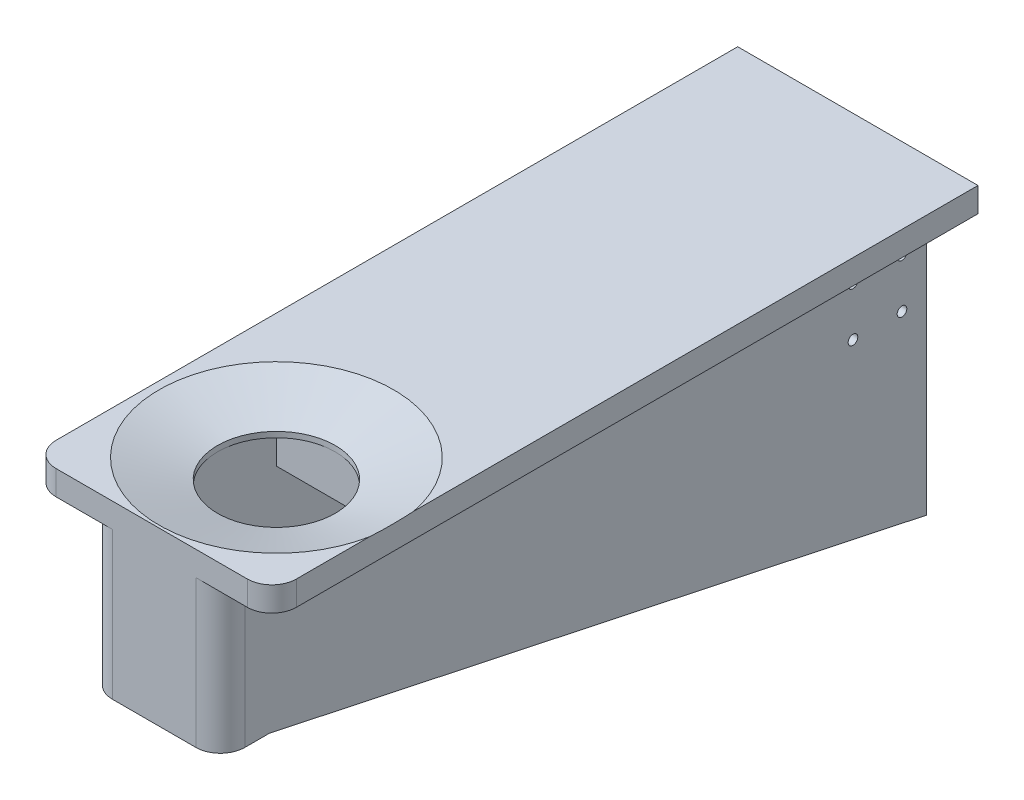
ISO-10303-21;
HEADER;
FILE_DESCRIPTION(('STEP AP214'),'2;1');
FILE_NAME('part.step','',(''),(''),'','','');
FILE_SCHEMA(('AUTOMOTIVE_DESIGN { 1 0 10303 214 1 1 1 1 }'));
ENDSEC;
DATA;
#1=APPLICATION_CONTEXT('core data for automotive mechanical design processes');
#2=APPLICATION_PROTOCOL_DEFINITION('international standard','automotive_design',2000,#1);
#3=PRODUCT_CONTEXT('',#1,'mechanical');
#4=PRODUCT('Part','Part','',(#3));
#5=PRODUCT_RELATED_PRODUCT_CATEGORY('part','',(#4));
#6=PRODUCT_DEFINITION_FORMATION('','',#4);
#7=PRODUCT_DEFINITION_CONTEXT('part definition',#1,'design');
#8=PRODUCT_DEFINITION('design','',#6,#7);
#9=PRODUCT_DEFINITION_SHAPE('','',#8);
#10=(LENGTH_UNIT() NAMED_UNIT(*) SI_UNIT(.MILLI.,.METRE.));
#11=(NAMED_UNIT(*) PLANE_ANGLE_UNIT() SI_UNIT($,.RADIAN.));
#12=(NAMED_UNIT(*) SI_UNIT($,.STERADIAN.) SOLID_ANGLE_UNIT());
#13=UNCERTAINTY_MEASURE_WITH_UNIT(LENGTH_MEASURE(1.E-05),#10,'distance_accuracy_value','');
#14=(GEOMETRIC_REPRESENTATION_CONTEXT(3) GLOBAL_UNCERTAINTY_ASSIGNED_CONTEXT((#13)) GLOBAL_UNIT_ASSIGNED_CONTEXT((#10,
#11,#12)) REPRESENTATION_CONTEXT('',''));
#15=CARTESIAN_POINT('',(0.,0.,0.));
#16=DIRECTION('',(0.,0.,1.));
#17=DIRECTION('',(1.,0.,0.));
#18=AXIS2_PLACEMENT_3D('',#15,#16,#17);
#19=CARTESIAN_POINT('',(17.145,-101.6,0.));
#20=DIRECTION('',(1.,0.,0.));
#21=DIRECTION('',(0.,0.,-1.));
#22=AXIS2_PLACEMENT_3D('',#19,#20,#21);
#23=PLANE('',#22);
#24=CARTESIAN_POINT('',(17.145,-12.7,-163.83));
#25=DIRECTION('',(1.,0.,0.));
#26=DIRECTION('',(0.,0.,-1.));
#27=AXIS2_PLACEMENT_3D('',#24,#25,#26);
#28=CIRCLE('',#27,1.24999999999999);
#29=CARTESIAN_POINT('',(17.145,-12.7,-165.08));
#30=VERTEX_POINT('',#29);
#31=EDGE_CURVE('E1086',#30,#30,#28,.T.);
#32=ORIENTED_EDGE('',*,*,#31,.F.);
#33=EDGE_LOOP('',(#32));
#34=FACE_BOUND('',#33,.T.);
#35=CARTESIAN_POINT('',(17.145,-25.4,-163.83));
#36=DIRECTION('',(1.,0.,0.));
#37=DIRECTION('',(0.,0.,-1.));
#38=AXIS2_PLACEMENT_3D('',#35,#36,#37);
#39=CIRCLE('',#38,1.24999999999999);
#40=CARTESIAN_POINT('',(17.145,-25.4,-165.08));
#41=VERTEX_POINT('',#40);
#42=EDGE_CURVE('E1074',#41,#41,#39,.T.);
#43=ORIENTED_EDGE('',*,*,#42,.F.);
#44=EDGE_LOOP('',(#43));
#45=FACE_BOUND('',#44,.T.);
#46=CARTESIAN_POINT('',(17.145,-25.4,-151.13));
#47=DIRECTION('',(1.,0.,0.));
#48=DIRECTION('',(0.,0.,-1.));
#49=AXIS2_PLACEMENT_3D('',#46,#47,#48);
#50=CIRCLE('',#49,1.24999999999999);
#51=CARTESIAN_POINT('',(17.145,-25.4,-152.38));
#52=VERTEX_POINT('',#51);
#53=EDGE_CURVE('E1095',#52,#52,#50,.T.);
#54=ORIENTED_EDGE('',*,*,#53,.F.);
#55=EDGE_LOOP('',(#54));
#56=FACE_BOUND('',#55,.T.);
#57=CARTESIAN_POINT('',(17.145,-12.7,-151.13));
#58=DIRECTION('',(1.,0.,0.));
#59=DIRECTION('',(0.,0.,-1.));
#60=AXIS2_PLACEMENT_3D('',#57,#58,#59);
#61=CIRCLE('',#60,1.24999999999999);
#62=CARTESIAN_POINT('',(17.145,-12.7,-152.38));
#63=VERTEX_POINT('',#62);
#64=EDGE_CURVE('E1068',#63,#63,#61,.T.);
#65=ORIENTED_EDGE('',*,*,#64,.F.);
#66=EDGE_LOOP('',(#65));
#67=FACE_BOUND('',#66,.T.);
#68=DIRECTION('',(0.,-1.,0.));
#69=VECTOR('',#68,1.);
#70=CARTESIAN_POINT('',(17.145,-101.6,-170.18));
#71=LINE('',#70,#69);
#72=CARTESIAN_POINT('',(17.145,0.,-170.18));
#73=VERTEX_POINT('',#72);
#74=CARTESIAN_POINT('',(17.145,-36.6200715561254,-170.18));
#75=VERTEX_POINT('',#74);
#76=EDGE_CURVE('E310',#73,#75,#71,.T.);
#77=ORIENTED_EDGE('',*,*,#76,.F.);
#78=DIRECTION('',(0.,0.,-1.));
#79=VECTOR('',#78,1.);
#80=CARTESIAN_POINT('',(17.145,0.,0.));
#81=LINE('',#80,#79);
#82=CARTESIAN_POINT('',(17.145,0.,-36.7310792907555));
#83=VERTEX_POINT('',#82);
#84=EDGE_CURVE('E451',#83,#73,#81,.T.);
#85=ORIENTED_EDGE('',*,*,#84,.F.);
#86=DIRECTION('',(0.,-1.,0.));
#87=VECTOR('',#86,1.);
#88=CARTESIAN_POINT('',(17.145,0.,-36.7310792907555));
#89=LINE('',#88,#87);
#90=CARTESIAN_POINT('',(17.145,-8.25462781159288,-36.7310792907555));
#91=VERTEX_POINT('',#90);
#92=EDGE_CURVE('E425',#83,#91,#89,.T.);
#93=ORIENTED_EDGE('',*,*,#92,.T.);
#94=DIRECTION('',(0.,-0.20791169081776,-0.978147600733805));
#95=VECTOR('',#94,1.);
#96=CARTESIAN_POINT('',(17.145,-0.427864833065413,0.0909454777759027));
#97=LINE('',#96,#95);
#98=EDGE_CURVE('E422',#91,#75,#97,.T.);
#99=ORIENTED_EDGE('',*,*,#98,.T.);
#100=EDGE_LOOP('',(#77,#85,#93,#99));
#101=FACE_BOUND('',#100,.T.);
#102=ADVANCED_FACE('F129',(#34,#45,#56,#67,#101),#23,.T.);
#103=CARTESIAN_POINT('',(46.355,-101.6,0.));
#104=DIRECTION('',(1.,0.,0.));
#105=DIRECTION('',(0.,0.,-1.));
#106=AXIS2_PLACEMENT_3D('',#103,#104,#105);
#107=PLANE('',#106);
#108=CARTESIAN_POINT('',(46.355,-12.7,-163.83));
#109=DIRECTION('',(1.,0.,0.));
#110=DIRECTION('',(0.,0.,-1.));
#111=AXIS2_PLACEMENT_3D('',#108,#109,#110);
#112=CIRCLE('',#111,1.24999999999999);
#113=CARTESIAN_POINT('',(46.355,-12.7,-165.08));
#114=VERTEX_POINT('',#113);
#115=EDGE_CURVE('E1082',#114,#114,#112,.T.);
#116=ORIENTED_EDGE('',*,*,#115,.T.);
#117=EDGE_LOOP('',(#116));
#118=FACE_BOUND('',#117,.T.);
#119=CARTESIAN_POINT('',(46.355,-25.4,-163.83));
#120=DIRECTION('',(1.,0.,0.));
#121=DIRECTION('',(0.,0.,-1.));
#122=AXIS2_PLACEMENT_3D('',#119,#120,#121);
#123=CIRCLE('',#122,1.24999999999999);
#124=CARTESIAN_POINT('',(46.355,-25.4,-165.08));
#125=VERTEX_POINT('',#124);
#126=EDGE_CURVE('E1079',#125,#125,#123,.T.);
#127=ORIENTED_EDGE('',*,*,#126,.T.);
#128=EDGE_LOOP('',(#127));
#129=FACE_BOUND('',#128,.T.);
#130=CARTESIAN_POINT('',(46.355,-25.4,-151.13));
#131=DIRECTION('',(1.,0.,0.));
#132=DIRECTION('',(0.,0.,-1.));
#133=AXIS2_PLACEMENT_3D('',#130,#131,#132);
#134=CIRCLE('',#133,1.24999999999999);
#135=CARTESIAN_POINT('',(46.355,-25.4,-152.38));
#136=VERTEX_POINT('',#135);
#137=EDGE_CURVE('E1101',#136,#136,#134,.T.);
#138=ORIENTED_EDGE('',*,*,#137,.T.);
#139=EDGE_LOOP('',(#138));
#140=FACE_BOUND('',#139,.T.);
#141=CARTESIAN_POINT('',(46.355,-12.7,-151.13));
#142=DIRECTION('',(1.,0.,0.));
#143=DIRECTION('',(0.,0.,-1.));
#144=AXIS2_PLACEMENT_3D('',#141,#142,#143);
#145=CIRCLE('',#144,1.24999999999999);
#146=CARTESIAN_POINT('',(46.355,-12.7,-152.38));
#147=VERTEX_POINT('',#146);
#148=EDGE_CURVE('E323',#147,#147,#145,.T.);
#149=ORIENTED_EDGE('',*,*,#148,.T.);
#150=EDGE_LOOP('',(#149));
#151=FACE_BOUND('',#150,.T.);
#152=DIRECTION('',(0.,0.,-1.));
#153=VECTOR('',#152,1.);
#154=CARTESIAN_POINT('',(46.355,0.,0.));
#155=LINE('',#154,#153);
#156=CARTESIAN_POINT('',(46.355,0.,-36.7310792907555));
#157=VERTEX_POINT('',#156);
#158=CARTESIAN_POINT('',(46.355,0.,-170.18));
#159=VERTEX_POINT('',#158);
#160=EDGE_CURVE('E322',#157,#159,#155,.T.);
#161=ORIENTED_EDGE('',*,*,#160,.T.);
#162=DIRECTION('',(0.,-1.,0.));
#163=VECTOR('',#162,1.);
#164=CARTESIAN_POINT('',(46.355,-101.6,-170.18));
#165=LINE('',#164,#163);
#166=CARTESIAN_POINT('',(46.355,-36.6200715561254,-170.18));
#167=VERTEX_POINT('',#166);
#168=EDGE_CURVE('E307',#159,#167,#165,.T.);
#169=ORIENTED_EDGE('',*,*,#168,.T.);
#170=DIRECTION('',(0.,0.20791169081776,0.978147600733805));
#171=VECTOR('',#170,1.);
#172=CARTESIAN_POINT('',(46.355,-4.81975558482133,-20.5712759904748));
#173=LINE('',#172,#171);
#174=CARTESIAN_POINT('',(46.355,-8.25462781159288,-36.7310792907555));
#175=VERTEX_POINT('',#174);
#176=EDGE_CURVE('E319',#167,#175,#173,.T.);
#177=ORIENTED_EDGE('',*,*,#176,.T.);
#178=DIRECTION('',(0.,1.,0.));
#179=VECTOR('',#178,1.);
#180=CARTESIAN_POINT('',(46.355,-101.6,-36.7310792907555));
#181=LINE('',#180,#179);
#182=EDGE_CURVE('E329',#175,#157,#181,.T.);
#183=ORIENTED_EDGE('',*,*,#182,.T.);
#184=EDGE_LOOP('',(#161,#169,#177,#183));
#185=FACE_BOUND('',#184,.T.);
#186=ADVANCED_FACE('F317',(#118,#129,#140,#151,#185),#107,.F.);
#187=CARTESIAN_POINT('',(0.,0.,0.));
#188=DIRECTION('',(0.,-1.,0.));
#189=DIRECTION('',(0.,0.,-1.));
#190=AXIS2_PLACEMENT_3D('',#187,#188,#189);
#191=PLANE('',#190);
#192=DIRECTION('',(-1.,0.,0.));
#193=VECTOR('',#192,1.);
#194=CARTESIAN_POINT('',(0.,0.,-170.18));
#195=LINE('',#194,#193);
#196=EDGE_CURVE('E1111',#159,#73,#195,.T.);
#197=ORIENTED_EDGE('',*,*,#196,.F.);
#198=ORIENTED_EDGE('',*,*,#160,.F.);
#199=DIRECTION('',(-1.,0.,0.));
#200=VECTOR('',#199,1.);
#201=CARTESIAN_POINT('',(47.625,0.,-36.7310792907555));
#202=LINE('',#201,#200);
#203=EDGE_CURVE('E440',#157,#83,#202,.T.);
#204=ORIENTED_EDGE('',*,*,#203,.T.);
#205=ORIENTED_EDGE('',*,*,#84,.T.);
#206=EDGE_LOOP('',(#197,#198,#204,#205));
#207=FACE_BOUND('',#206,.T.);
#208=ADVANCED_FACE('F384',(#207),#191,.T.);
#209=CARTESIAN_POINT('',(47.625,0.,-36.7310792907555));
#210=DIRECTION('',(0.,0.,-1.));
#211=DIRECTION('',(-1.,0.,0.));
#212=AXIS2_PLACEMENT_3D('',#209,#210,#211);
#213=PLANE('',#212);
#214=ORIENTED_EDGE('',*,*,#182,.F.);
#215=DIRECTION('',(-1.,0.,0.));
#216=VECTOR('',#215,1.);
#217=CARTESIAN_POINT('',(47.625,-8.25462781159288,-36.7310792907555));
#218=LINE('',#217,#216);
#219=EDGE_CURVE('E327',#175,#91,#218,.T.);
#220=ORIENTED_EDGE('',*,*,#219,.T.);
#221=ORIENTED_EDGE('',*,*,#92,.F.);
#222=ORIENTED_EDGE('',*,*,#203,.F.);
#223=EDGE_LOOP('',(#214,#220,#221,#222));
#224=FACE_BOUND('',#223,.T.);
#225=ADVANCED_FACE('F555',(#224),#213,.T.);
#226=CARTESIAN_POINT('',(47.625,-0.427864833065413,0.0909454777759031));
#227=DIRECTION('',(0.,0.978147600733805,-0.20791169081776));
#228=DIRECTION('',(0.,0.20791169081776,0.978147600733805));
#229=AXIS2_PLACEMENT_3D('',#226,#227,#228);
#230=PLANE('',#229);
#231=DIRECTION('',(1.,0.,0.));
#232=VECTOR('',#231,1.);
#233=CARTESIAN_POINT('',(47.625,-36.6200715561254,-170.18));
#234=LINE('',#233,#232);
#235=EDGE_CURVE('E13',#75,#167,#234,.T.);
#236=ORIENTED_EDGE('',*,*,#235,.F.);
#237=ORIENTED_EDGE('',*,*,#98,.F.);
#238=ORIENTED_EDGE('',*,*,#219,.F.);
#239=ORIENTED_EDGE('',*,*,#176,.F.);
#240=EDGE_LOOP('',(#236,#237,#238,#239));
#241=FACE_BOUND('',#240,.T.);
#242=ADVANCED_FACE('F326',(#241),#230,.T.);
#243=CARTESIAN_POINT('',(0.,0.,-170.18));
#244=DIRECTION('',(0.,0.,1.));
#245=DIRECTION('',(1.,0.,0.));
#246=AXIS2_PLACEMENT_3D('',#243,#244,#245);
#247=PLANE('',#246);
#248=ORIENTED_EDGE('',*,*,#196,.T.);
#249=ORIENTED_EDGE('',*,*,#76,.T.);
#250=ORIENTED_EDGE('',*,*,#235,.T.);
#251=ORIENTED_EDGE('',*,*,#168,.F.);
#252=EDGE_LOOP('',(#248,#249,#250,#251));
#253=FACE_BOUND('',#252,.T.);
#254=DIRECTION('',(0.,1.,0.));
#255=VECTOR('',#254,1.);
#256=CARTESIAN_POINT('',(62.23,6.35,-170.18));
#257=LINE('',#256,#255);
#258=CARTESIAN_POINT('',(62.23,0.,-170.18));
#259=VERTEX_POINT('',#258);
#260=CARTESIAN_POINT('',(62.23,6.35,-170.18));
#261=VERTEX_POINT('',#260);
#262=EDGE_CURVE('E1122',#259,#261,#257,.T.);
#263=ORIENTED_EDGE('',*,*,#262,.F.);
#264=DIRECTION('',(-1.,0.,0.));
#265=VECTOR('',#264,1.);
#266=CARTESIAN_POINT('',(0.,0.,-170.18));
#267=LINE('',#266,#265);
#268=CARTESIAN_POINT('',(48.895,0.,-170.18));
#269=VERTEX_POINT('',#268);
#270=EDGE_CURVE('E1121',#259,#269,#267,.T.);
#271=ORIENTED_EDGE('',*,*,#270,.T.);
#272=DIRECTION('',(0.,-1.,0.));
#273=VECTOR('',#272,1.);
#274=CARTESIAN_POINT('',(48.895,-101.6,-170.18));
#275=LINE('',#274,#273);
#276=CARTESIAN_POINT('',(48.895,-74.2728756650044,-170.18));
#277=VERTEX_POINT('',#276);
#278=EDGE_CURVE('E154',#269,#277,#275,.T.);
#279=ORIENTED_EDGE('',*,*,#278,.T.);
#280=DIRECTION('',(-1.,0.,0.));
#281=VECTOR('',#280,1.);
#282=CARTESIAN_POINT('',(47.625,-74.2728756650044,-170.18));
#283=LINE('',#282,#281);
#284=CARTESIAN_POINT('',(14.605,-74.2728756650044,-170.18));
#285=VERTEX_POINT('',#284);
#286=EDGE_CURVE('E1113',#277,#285,#283,.T.);
#287=ORIENTED_EDGE('',*,*,#286,.T.);
#288=DIRECTION('',(0.,-1.,0.));
#289=VECTOR('',#288,1.);
#290=CARTESIAN_POINT('',(14.605,-101.6,-170.18));
#291=LINE('',#290,#289);
#292=CARTESIAN_POINT('',(14.605,0.,-170.18));
#293=VERTEX_POINT('',#292);
#294=EDGE_CURVE('E1116',#293,#285,#291,.T.);
#295=ORIENTED_EDGE('',*,*,#294,.F.);
#296=CARTESIAN_POINT('',(0.,0.,-170.18));
#297=VERTEX_POINT('',#296);
#298=EDGE_CURVE('E1119',#293,#297,#267,.T.);
#299=ORIENTED_EDGE('',*,*,#298,.T.);
#300=DIRECTION('',(0.,-1.,0.));
#301=VECTOR('',#300,1.);
#302=CARTESIAN_POINT('',(0.,6.35,-170.18));
#303=LINE('',#302,#301);
#304=CARTESIAN_POINT('',(0.,6.35,-170.18));
#305=VERTEX_POINT('',#304);
#306=EDGE_CURVE('E514',#305,#297,#303,.T.);
#307=ORIENTED_EDGE('',*,*,#306,.F.);
#308=DIRECTION('',(-1.,0.,0.));
#309=VECTOR('',#308,1.);
#310=CARTESIAN_POINT('',(0.,6.35,-170.18));
#311=LINE('',#310,#309);
#312=EDGE_CURVE('E511',#261,#305,#311,.T.);
#313=ORIENTED_EDGE('',*,*,#312,.F.);
#314=EDGE_LOOP('',(#263,#271,#279,#287,#295,#299,#307,#313));
#315=FACE_BOUND('',#314,.T.);
#316=DIRECTION('',(0.,-1.,0.));
#317=VECTOR('',#316,1.);
#318=CARTESIAN_POINT('',(17.145,-101.6,-170.18));
#319=LINE('',#318,#317);
#320=CARTESIAN_POINT('',(17.145,-39.8660029448219,-170.18));
#321=VERTEX_POINT('',#320);
#322=CARTESIAN_POINT('',(17.145,-71.026944276308,-170.18));
#323=VERTEX_POINT('',#322);
#324=EDGE_CURVE('E146',#321,#323,#319,.T.);
#325=ORIENTED_EDGE('',*,*,#324,.T.);
#326=DIRECTION('',(1.,0.,0.));
#327=VECTOR('',#326,1.);
#328=CARTESIAN_POINT('',(47.625,-71.026944276308,-170.18));
#329=LINE('',#328,#327);
#330=CARTESIAN_POINT('',(46.355,-71.026944276308,-170.18));
#331=VERTEX_POINT('',#330);
#332=EDGE_CURVE('E412',#323,#331,#329,.T.);
#333=ORIENTED_EDGE('',*,*,#332,.T.);
#334=DIRECTION('',(0.,-1.,0.));
#335=VECTOR('',#334,1.);
#336=CARTESIAN_POINT('',(46.355,-101.6,-170.18));
#337=LINE('',#336,#335);
#338=CARTESIAN_POINT('',(46.355,-39.8660029448219,-170.18));
#339=VERTEX_POINT('',#338);
#340=EDGE_CURVE('E411',#339,#331,#337,.T.);
#341=ORIENTED_EDGE('',*,*,#340,.F.);
#342=DIRECTION('',(1.,0.,0.));
#343=VECTOR('',#342,1.);
#344=CARTESIAN_POINT('',(47.625,-39.8660029448219,-170.18));
#345=LINE('',#344,#343);
#346=EDGE_CURVE('E417',#321,#339,#345,.T.);
#347=ORIENTED_EDGE('',*,*,#346,.F.);
#348=EDGE_LOOP('',(#325,#333,#341,#347));
#349=FACE_BOUND('',#348,.T.);
#350=ADVANCED_FACE('F306',(#253,#315,#349),#247,.F.);
#351=ORIENTED_EDGE('',*,*,#270,.F.);
#352=DIRECTION('',(0.,0.,-1.));
#353=VECTOR('',#352,1.);
#354=CARTESIAN_POINT('',(62.23,0.,0.));
#355=LINE('',#354,#353);
#356=CARTESIAN_POINT('',(62.23,0.,6.35));
#357=VERTEX_POINT('',#356);
#358=EDGE_CURVE('E463',#357,#259,#355,.T.);
#359=ORIENTED_EDGE('',*,*,#358,.F.);
#360=CARTESIAN_POINT('',(55.88,0.,6.35));
#361=DIRECTION('',(0.,-1.,0.));
#362=DIRECTION('',(0.,0.,-1.));
#363=AXIS2_PLACEMENT_3D('',#360,#361,#362);
#364=CIRCLE('',#363,6.35);
#365=CARTESIAN_POINT('',(55.88,0.,12.7));
#366=VERTEX_POINT('',#365);
#367=EDGE_CURVE('E1028',#357,#366,#364,.T.);
#368=ORIENTED_EDGE('',*,*,#367,.T.);
#369=DIRECTION('',(1.,0.,0.));
#370=VECTOR('',#369,1.);
#371=CARTESIAN_POINT('',(48.895,0.,12.7));
#372=LINE('',#371,#370);
#373=CARTESIAN_POINT('',(42.545,0.,12.7));
#374=VERTEX_POINT('',#373);
#375=EDGE_CURVE('E523',#374,#366,#372,.T.);
#376=ORIENTED_EDGE('',*,*,#375,.F.);
#377=CARTESIAN_POINT('',(42.545,0.,6.35));
#378=DIRECTION('',(0.,-1.,0.));
#379=DIRECTION('',(0.,0.,-1.));
#380=AXIS2_PLACEMENT_3D('',#377,#378,#379);
#381=CIRCLE('',#380,6.35);
#382=CARTESIAN_POINT('',(48.895,0.,6.35));
#383=VERTEX_POINT('',#382);
#384=EDGE_CURVE('E138',#374,#383,#381,.F.);
#385=ORIENTED_EDGE('',*,*,#384,.T.);
#386=DIRECTION('',(0.,0.,-1.));
#387=VECTOR('',#386,1.);
#388=CARTESIAN_POINT('',(48.895,0.,0.));
#389=LINE('',#388,#387);
#390=EDGE_CURVE('E447',#383,#269,#389,.T.);
#391=ORIENTED_EDGE('',*,*,#390,.T.);
#392=EDGE_LOOP('',(#351,#359,#368,#376,#385,#391));
#393=FACE_BOUND('',#392,.T.);
#394=ADVANCED_FACE('F400',(#393),#191,.T.);
#395=CARTESIAN_POINT('',(0.,6.35,0.));
#396=DIRECTION('',(0.,-1.,0.));
#397=DIRECTION('',(0.,0.,-1.));
#398=AXIS2_PLACEMENT_3D('',#395,#396,#397);
#399=PLANE('',#398);
#400=DIRECTION('',(0.,0.,-1.));
#401=VECTOR('',#400,1.);
#402=CARTESIAN_POINT('',(62.23,6.35,0.));
#403=LINE('',#402,#401);
#404=CARTESIAN_POINT('',(62.23,6.35,-24.0041575523088));
#405=VERTEX_POINT('',#404);
#406=EDGE_CURVE('E462',#405,#261,#403,.T.);
#407=ORIENTED_EDGE('',*,*,#406,.T.);
#408=ORIENTED_EDGE('',*,*,#312,.T.);
#409=DIRECTION('',(0.,0.,1.));
#410=VECTOR('',#409,1.);
#411=CARTESIAN_POINT('',(0.,6.35,0.));
#412=LINE('',#411,#410);
#413=CARTESIAN_POINT('',(0.,6.35,6.35));
#414=VERTEX_POINT('',#413);
#415=EDGE_CURVE('E460',#305,#414,#412,.T.);
#416=ORIENTED_EDGE('',*,*,#415,.T.);
#417=CARTESIAN_POINT('',(6.35,6.35,6.35));
#418=DIRECTION('',(0.,-1.,0.));
#419=DIRECTION('',(0.,0.,-1.));
#420=AXIS2_PLACEMENT_3D('',#417,#418,#419);
#421=CIRCLE('',#420,6.35);
#422=CARTESIAN_POINT('',(6.35000000000002,6.35,12.7));
#423=VERTEX_POINT('',#422);
#424=EDGE_CURVE('E1039',#414,#423,#421,.F.);
#425=ORIENTED_EDGE('',*,*,#424,.T.);
#426=DIRECTION('',(-1.,0.,0.));
#427=VECTOR('',#426,1.);
#428=CARTESIAN_POINT('',(62.23,6.35,12.7));
#429=LINE('',#428,#427);
#430=CARTESIAN_POINT('',(55.88,6.35,12.7));
#431=VERTEX_POINT('',#430);
#432=EDGE_CURVE('E526',#431,#423,#429,.T.);
#433=ORIENTED_EDGE('',*,*,#432,.F.);
#434=CARTESIAN_POINT('',(55.88,6.35,6.35));
#435=DIRECTION('',(0.,-1.,0.));
#436=DIRECTION('',(0.,0.,-1.));
#437=AXIS2_PLACEMENT_3D('',#434,#435,#436);
#438=CIRCLE('',#437,6.35);
#439=CARTESIAN_POINT('',(62.23,6.35,6.35));
#440=VERTEX_POINT('',#439);
#441=EDGE_CURVE('E1037',#431,#440,#438,.F.);
#442=ORIENTED_EDGE('',*,*,#441,.T.);
#443=CARTESIAN_POINT('',(62.23,6.35,-12.6280010292022));
#444=VERTEX_POINT('',#443);
#445=EDGE_CURVE('E464',#440,#444,#403,.T.);
#446=ORIENTED_EDGE('',*,*,#445,.T.);
#447=CARTESIAN_POINT('',(32.385,6.35,-18.3160792907555));
#448=DIRECTION('',(0.,-1.,0.));
#449=DIRECTION('',(0.,0.,-1.));
#450=AXIS2_PLACEMENT_3D('',#447,#448,#449);
#451=CIRCLE('',#450,30.3822030029021);
#452=EDGE_CURVE('E341',#444,#405,#451,.T.);
#453=ORIENTED_EDGE('',*,*,#452,.T.);
#454=EDGE_LOOP('',(#407,#408,#416,#425,#433,#442,#446,#453));
#455=FACE_BOUND('',#454,.T.);
#456=ADVANCED_FACE('F401',(#455),#399,.F.);
#457=DIRECTION('',(0.,0.20791169081776,0.978147600733805));
#458=VECTOR('',#457,1.);
#459=CARTESIAN_POINT('',(46.355,-7.92537421715116,-19.9111563721284));
#460=LINE('',#459,#458);
#461=CARTESIAN_POINT('',(46.355,-10.825692116987,-33.5560792907555));
#462=VERTEX_POINT('',#461);
#463=EDGE_CURVE('E333',#339,#462,#460,.T.);
#464=ORIENTED_EDGE('',*,*,#463,.F.);
#465=ORIENTED_EDGE('',*,*,#340,.T.);
#466=DIRECTION('',(0.,0.207911690817761,0.978147600733805));
#467=VECTOR('',#466,1.);
#468=CARTESIAN_POINT('',(46.355,-37.7393130875175,-13.5740080360031));
#469=LINE('',#468,#467);
#470=CARTESIAN_POINT('',(46.355,-35.5079094487708,-3.07607929075551));
#471=VERTEX_POINT('',#470);
#472=EDGE_CURVE('E328',#331,#471,#469,.T.);
#473=ORIENTED_EDGE('',*,*,#472,.T.);
#474=DIRECTION('',(0.,1.,0.));
#475=VECTOR('',#474,1.);
#476=CARTESIAN_POINT('',(46.355,-101.6,-3.07607929075552));
#477=LINE('',#476,#475);
#478=CARTESIAN_POINT('',(46.355,0.,-3.07607929075551));
#479=VERTEX_POINT('',#478);
#480=EDGE_CURVE('E331',#471,#479,#477,.T.);
#481=ORIENTED_EDGE('',*,*,#480,.T.);
#482=CARTESIAN_POINT('',(46.355,0.,-12.2253732561484));
#483=VERTEX_POINT('',#482);
#484=EDGE_CURVE('E444',#479,#483,#155,.T.);
#485=ORIENTED_EDGE('',*,*,#484,.T.);
#486=DIRECTION('',(0.,0.,-1.));
#487=VECTOR('',#486,1.);
#488=CARTESIAN_POINT('',(46.355,0.,0.));
#489=LINE('',#488,#487);
#490=CARTESIAN_POINT('',(46.355,0.,-24.4067853253627));
#491=VERTEX_POINT('',#490);
#492=EDGE_CURVE('E501',#483,#491,#489,.T.);
#493=ORIENTED_EDGE('',*,*,#492,.T.);
#494=CARTESIAN_POINT('',(46.355,0.,-33.5560792907555));
#495=VERTEX_POINT('',#494);
#496=EDGE_CURVE('E448',#491,#495,#155,.T.);
#497=ORIENTED_EDGE('',*,*,#496,.T.);
#498=DIRECTION('',(0.,1.,0.));
#499=VECTOR('',#498,1.);
#500=CARTESIAN_POINT('',(46.355,-101.6,-33.5560792907555));
#501=LINE('',#500,#499);
#502=EDGE_CURVE('E466',#462,#495,#501,.T.);
#503=ORIENTED_EDGE('',*,*,#502,.F.);
#504=EDGE_LOOP('',(#464,#465,#473,#481,#485,#493,#497,#503));
#505=FACE_BOUND('',#504,.T.);
#506=ADVANCED_FACE('F387',(#505),#107,.F.);
#507=ORIENTED_EDGE('',*,*,#324,.F.);
#508=DIRECTION('',(0.,-0.20791169081776,-0.978147600733805));
#509=VECTOR('',#508,1.);
#510=CARTESIAN_POINT('',(17.145,-3.53348346539524,0.75106509612229));
#511=LINE('',#510,#509);
#512=CARTESIAN_POINT('',(17.145,-10.825692116987,-33.5560792907555));
#513=VERTEX_POINT('',#512);
#514=EDGE_CURVE('E406',#513,#321,#511,.T.);
#515=ORIENTED_EDGE('',*,*,#514,.F.);
#516=DIRECTION('',(0.,-1.,0.));
#517=VECTOR('',#516,1.);
#518=CARTESIAN_POINT('',(17.145,0.,-33.5560792907555));
#519=LINE('',#518,#517);
#520=CARTESIAN_POINT('',(17.145,0.,-33.5560792907555));
#521=VERTEX_POINT('',#520);
#522=EDGE_CURVE('E433',#521,#513,#519,.T.);
#523=ORIENTED_EDGE('',*,*,#522,.F.);
#524=CARTESIAN_POINT('',(17.145,0.,-18.3160792907555));
#525=VERTEX_POINT('',#524);
#526=EDGE_CURVE('E456',#525,#521,#81,.T.);
#527=ORIENTED_EDGE('',*,*,#526,.F.);
#528=CARTESIAN_POINT('',(17.145,0.,-3.07607929075551));
#529=VERTEX_POINT('',#528);
#530=EDGE_CURVE('E452',#529,#525,#81,.T.);
#531=ORIENTED_EDGE('',*,*,#530,.F.);
#532=DIRECTION('',(0.,-1.,0.));
#533=VECTOR('',#532,1.);
#534=CARTESIAN_POINT('',(17.145,0.,-3.07607929075551));
#535=LINE('',#534,#533);
#536=CARTESIAN_POINT('',(17.145,-35.5079094487708,-3.07607929075551));
#537=VERTEX_POINT('',#536);
#538=EDGE_CURVE('E494',#529,#537,#535,.T.);
#539=ORIENTED_EDGE('',*,*,#538,.T.);
#540=DIRECTION('',(0.,-0.207911690817761,-0.978147600733805));
#541=VECTOR('',#540,1.);
#542=CARTESIAN_POINT('',(17.145,-33.3474223357616,7.08821343224763));
#543=LINE('',#542,#541);
#544=EDGE_CURVE('E410',#537,#323,#543,.T.);
#545=ORIENTED_EDGE('',*,*,#544,.T.);
#546=EDGE_LOOP('',(#507,#515,#523,#527,#531,#539,#545));
#547=FACE_BOUND('',#546,.T.);
#548=ADVANCED_FACE('F380',(#547),#23,.T.);
#549=CARTESIAN_POINT('',(32.385,0.,-18.3160792907555));
#550=DIRECTION('',(0.,-1.,0.));
#551=DIRECTION('',(0.,0.,-1.));
#552=AXIS2_PLACEMENT_3D('',#549,#550,#551);
#553=CIRCLE('',#552,15.24);
#554=CARTESIAN_POINT('',(32.385,0.,-33.5560792907555));
#555=VERTEX_POINT('',#554);
#556=EDGE_CURVE('E540',#555,#491,#553,.T.);
#557=ORIENTED_EDGE('',*,*,#556,.F.);
#558=DIRECTION('',(-1.,0.,0.));
#559=VECTOR('',#558,1.);
#560=CARTESIAN_POINT('',(47.625,0.,-33.5560792907555));
#561=LINE('',#560,#559);
#562=EDGE_CURVE('E437',#495,#555,#561,.T.);
#563=ORIENTED_EDGE('',*,*,#562,.F.);
#564=ORIENTED_EDGE('',*,*,#496,.F.);
#565=EDGE_LOOP('',(#557,#563,#564));
#566=FACE_BOUND('',#565,.T.);
#567=ADVANCED_FACE('F392',(#566),#191,.T.);
#568=CARTESIAN_POINT('',(32.385,0.,-3.07607929075551));
#569=VERTEX_POINT('',#568);
#570=EDGE_CURVE('E507',#483,#569,#553,.T.);
#571=ORIENTED_EDGE('',*,*,#570,.F.);
#572=ORIENTED_EDGE('',*,*,#484,.F.);
#573=DIRECTION('',(-1.,0.,0.));
#574=VECTOR('',#573,1.);
#575=CARTESIAN_POINT('',(47.625,0.,-3.07607929075551));
#576=LINE('',#575,#574);
#577=EDGE_CURVE('E427',#479,#569,#576,.T.);
#578=ORIENTED_EDGE('',*,*,#577,.T.);
#579=EDGE_LOOP('',(#571,#572,#578));
#580=FACE_BOUND('',#579,.T.);
#581=ADVANCED_FACE('F398',(#580),#191,.T.);
#582=EDGE_CURVE('E487',#569,#525,#553,.T.);
#583=ORIENTED_EDGE('',*,*,#582,.F.);
#584=EDGE_CURVE('E489',#569,#529,#576,.T.);
#585=ORIENTED_EDGE('',*,*,#584,.T.);
#586=ORIENTED_EDGE('',*,*,#530,.T.);
#587=EDGE_LOOP('',(#583,#585,#586));
#588=FACE_BOUND('',#587,.T.);
#589=ADVANCED_FACE('F486',(#588),#191,.T.);
#590=CARTESIAN_POINT('',(47.625,-3.53348346539524,0.751065096122291));
#591=DIRECTION('',(0.,0.978147600733805,-0.20791169081776));
#592=DIRECTION('',(0.,0.20791169081776,0.978147600733805));
#593=AXIS2_PLACEMENT_3D('',#590,#591,#592);
#594=PLANE('',#593);
#595=ORIENTED_EDGE('',*,*,#514,.T.);
#596=ORIENTED_EDGE('',*,*,#346,.T.);
#597=ORIENTED_EDGE('',*,*,#463,.T.);
#598=DIRECTION('',(-1.,0.,0.));
#599=VECTOR('',#598,1.);
#600=CARTESIAN_POINT('',(47.625,-10.825692116987,-33.5560792907555));
#601=LINE('',#600,#599);
#602=EDGE_CURVE('E420',#462,#513,#601,.T.);
#603=ORIENTED_EDGE('',*,*,#602,.T.);
#604=EDGE_LOOP('',(#595,#596,#597,#603));
#605=FACE_BOUND('',#604,.T.);
#606=ADVANCED_FACE('F416',(#605),#594,.F.);
#607=CARTESIAN_POINT('',(47.625,0.,-33.5560792907555));
#608=DIRECTION('',(0.,0.,-1.));
#609=DIRECTION('',(-1.,0.,0.));
#610=AXIS2_PLACEMENT_3D('',#607,#608,#609);
#611=PLANE('',#610);
#612=ORIENTED_EDGE('',*,*,#602,.F.);
#613=ORIENTED_EDGE('',*,*,#502,.T.);
#614=ORIENTED_EDGE('',*,*,#562,.T.);
#615=EDGE_CURVE('E436',#555,#521,#561,.T.);
#616=ORIENTED_EDGE('',*,*,#615,.T.);
#617=ORIENTED_EDGE('',*,*,#522,.T.);
#618=EDGE_LOOP('',(#612,#613,#614,#616,#617));
#619=FACE_BOUND('',#618,.T.);
#620=ADVANCED_FACE('F477',(#619),#611,.F.);
#621=EDGE_CURVE('E539',#525,#555,#553,.T.);
#622=ORIENTED_EDGE('',*,*,#621,.F.);
#623=ORIENTED_EDGE('',*,*,#526,.T.);
#624=ORIENTED_EDGE('',*,*,#615,.F.);
#625=EDGE_LOOP('',(#622,#623,#624));
#626=FACE_BOUND('',#625,.T.);
#627=ADVANCED_FACE('F546',(#626),#191,.T.);
#628=CARTESIAN_POINT('',(47.625,-33.3474223357616,7.08821343224763));
#629=DIRECTION('',(0.,0.978147600733805,-0.207911690817761));
#630=DIRECTION('',(0.,0.207911690817761,0.978147600733805));
#631=AXIS2_PLACEMENT_3D('',#628,#629,#630);
#632=PLANE('',#631);
#633=ORIENTED_EDGE('',*,*,#332,.F.);
#634=ORIENTED_EDGE('',*,*,#544,.F.);
#635=DIRECTION('',(-1.,0.,0.));
#636=VECTOR('',#635,1.);
#637=CARTESIAN_POINT('',(47.625,-35.5079094487708,-3.07607929075551));
#638=LINE('',#637,#636);
#639=EDGE_CURVE('E423',#471,#537,#638,.T.);
#640=ORIENTED_EDGE('',*,*,#639,.F.);
#641=ORIENTED_EDGE('',*,*,#472,.F.);
#642=EDGE_LOOP('',(#633,#634,#640,#641));
#643=FACE_BOUND('',#642,.T.);
#644=ADVANCED_FACE('F510',(#643),#632,.T.);
#645=CARTESIAN_POINT('',(47.625,0.,-3.07607929075551));
#646=DIRECTION('',(0.,0.,-1.));
#647=DIRECTION('',(0.,1.,0.));
#648=AXIS2_PLACEMENT_3D('',#645,#646,#647);
#649=PLANE('',#648);
#650=ORIENTED_EDGE('',*,*,#480,.F.);
#651=ORIENTED_EDGE('',*,*,#639,.T.);
#652=ORIENTED_EDGE('',*,*,#538,.F.);
#653=ORIENTED_EDGE('',*,*,#584,.F.);
#654=ORIENTED_EDGE('',*,*,#577,.F.);
#655=EDGE_LOOP('',(#650,#651,#652,#653,#654));
#656=FACE_BOUND('',#655,.T.);
#657=ADVANCED_FACE('F496',(#656),#649,.T.);
#658=CARTESIAN_POINT('',(32.385,30.48,-18.3160792907555));
#659=DIRECTION('',(0.,-1.,0.));
#660=DIRECTION('',(0.,0.,-1.));
#661=AXIS2_PLACEMENT_3D('',#658,#659,#660);
#662=CYLINDRICAL_SURFACE('',#661,15.24);
#663=CARTESIAN_POINT('',(32.385,1.43000000000004,-18.3160792907555));
#664=DIRECTION('',(0.,-1.,0.));
#665=DIRECTION('',(0.,0.,-1.));
#666=AXIS2_PLACEMENT_3D('',#663,#664,#665);
#667=CIRCLE('',#666,15.24);
#668=CARTESIAN_POINT('',(32.385,1.43000000000004,-33.5560792907555));
#669=VERTEX_POINT('',#668);
#670=EDGE_CURVE('E353',#669,#669,#667,.F.);
#671=ORIENTED_EDGE('',*,*,#670,.T.);
#672=EDGE_LOOP('',(#671));
#673=FACE_BOUND('',#672,.T.);
#674=ORIENTED_EDGE('',*,*,#556,.T.);
#675=EDGE_CURVE('E542',#491,#483,#553,.T.);
#676=ORIENTED_EDGE('',*,*,#675,.T.);
#677=ORIENTED_EDGE('',*,*,#570,.T.);
#678=ORIENTED_EDGE('',*,*,#582,.T.);
#679=ORIENTED_EDGE('',*,*,#621,.T.);
#680=EDGE_LOOP('',(#674,#676,#677,#678,#679));
#681=FACE_BOUND('',#680,.T.);
#682=ADVANCED_FACE('F373',(#673,#681),#662,.F.);
#683=CARTESIAN_POINT('',(32.385,0.,-18.3160792907555));
#684=DIRECTION('',(0.,-1.,0.));
#685=DIRECTION('',(0.,0.,-1.));
#686=AXIS2_PLACEMENT_3D('',#683,#684,#685);
#687=PLANE('',#686);
#688=ORIENTED_EDGE('',*,*,#675,.F.);
#689=ORIENTED_EDGE('',*,*,#492,.F.);
#690=EDGE_LOOP('',(#688,#689));
#691=FACE_BOUND('',#690,.T.);
#692=ADVANCED_FACE('F368',(#691),#687,.F.);
#693=CARTESIAN_POINT('',(0.,6.35,0.));
#694=DIRECTION('',(1.,0.,0.));
#695=DIRECTION('',(0.,0.,-1.));
#696=AXIS2_PLACEMENT_3D('',#693,#694,#695);
#697=PLANE('',#696);
#698=ORIENTED_EDGE('',*,*,#415,.F.);
#699=ORIENTED_EDGE('',*,*,#306,.T.);
#700=DIRECTION('',(0.,0.,1.));
#701=VECTOR('',#700,1.);
#702=CARTESIAN_POINT('',(0.,0.,0.));
#703=LINE('',#702,#701);
#704=CARTESIAN_POINT('',(0.,0.,6.35));
#705=VERTEX_POINT('',#704);
#706=EDGE_CURVE('E459',#297,#705,#703,.T.);
#707=ORIENTED_EDGE('',*,*,#706,.T.);
#708=DIRECTION('',(0.,-1.,0.));
#709=VECTOR('',#708,1.);
#710=CARTESIAN_POINT('',(0.,6.35,6.35));
#711=LINE('',#710,#709);
#712=EDGE_CURVE('E1041',#705,#414,#711,.F.);
#713=ORIENTED_EDGE('',*,*,#712,.T.);
#714=EDGE_LOOP('',(#698,#699,#707,#713));
#715=FACE_BOUND('',#714,.T.);
#716=ADVANCED_FACE('F364',(#715),#697,.F.);
#717=CARTESIAN_POINT('',(62.23,6.35,0.));
#718=DIRECTION('',(-1.,0.,0.));
#719=DIRECTION('',(0.,0.,1.));
#720=AXIS2_PLACEMENT_3D('',#717,#718,#719);
#721=PLANE('',#720);
#722=ORIENTED_EDGE('',*,*,#358,.T.);
#723=ORIENTED_EDGE('',*,*,#262,.T.);
#724=ORIENTED_EDGE('',*,*,#406,.F.);
#725=CARTESIAN_POINT('',(62.23,6.35,-24.0041575523088));
#726=CARTESIAN_POINT('',(62.23,6.32118173333556,-23.5305068723529));
#727=CARTESIAN_POINT('',(62.23,6.29583607563335,-23.0566496451058));
#728=CARTESIAN_POINT('',(62.23,6.25224496504518,-22.1086045960153));
#729=CARTESIAN_POINT('',(62.23,6.23399957949236,-21.6344167710795));
#730=CARTESIAN_POINT('',(62.23,6.19017548206693,-20.2124175490699));
#731=CARTESIAN_POINT('',(62.23,6.17545216348164,-19.2642484199127));
#732=CARTESIAN_POINT('',(62.23,6.17545216348164,-17.3679101615983));
#733=CARTESIAN_POINT('',(62.23,6.19017548206693,-16.4197410324411));
#734=CARTESIAN_POINT('',(62.23,6.23399957949236,-14.9977418104315));
#735=CARTESIAN_POINT('',(62.23,6.25224496504518,-14.5235539854958));
#736=CARTESIAN_POINT('',(62.23,6.29583607563335,-13.5755089364052));
#737=CARTESIAN_POINT('',(62.23,6.32118173333556,-13.1016517091581));
#738=CARTESIAN_POINT('',(62.23,6.35,-12.6280010292022));
#739=B_SPLINE_CURVE_WITH_KNOTS('',3,(#725,#726,#727,#728,#729,#730,#731,#732,#733,#734,#735,
#736,#737,#738),.UNSPECIFIED.,.F.,.F.,(4,2,2,2,2,2,4),(0.,1.42355618270141,2.84712586491133,
5.69149522447983,8.53586458404834,9.95943426625825,11.3829904489597),.UNSPECIFIED.);
#740=EDGE_CURVE('E344',#405,#444,#739,.T.);
#741=ORIENTED_EDGE('',*,*,#740,.T.);
#742=ORIENTED_EDGE('',*,*,#445,.F.);
#743=DIRECTION('',(0.,1.,0.));
#744=VECTOR('',#743,1.);
#745=CARTESIAN_POINT('',(62.23,0.,6.35));
#746=LINE('',#745,#744);
#747=EDGE_CURVE('E1033',#440,#357,#746,.F.);
#748=ORIENTED_EDGE('',*,*,#747,.T.);
#749=EDGE_LOOP('',(#722,#723,#724,#741,#742,#748));
#750=FACE_BOUND('',#749,.T.);
#751=ADVANCED_FACE('F359',(#750),#721,.F.);
#752=ORIENTED_EDGE('',*,*,#298,.F.);
#753=DIRECTION('',(0.,0.,-1.));
#754=VECTOR('',#753,1.);
#755=CARTESIAN_POINT('',(14.605,0.,0.));
#756=LINE('',#755,#754);
#757=CARTESIAN_POINT('',(14.605,0.,6.35));
#758=VERTEX_POINT('',#757);
#759=EDGE_CURVE('E455',#758,#293,#756,.T.);
#760=ORIENTED_EDGE('',*,*,#759,.F.);
#761=CARTESIAN_POINT('',(20.955,0.,6.35));
#762=DIRECTION('',(0.,-1.,0.));
#763=DIRECTION('',(0.,0.,-1.));
#764=AXIS2_PLACEMENT_3D('',#761,#762,#763);
#765=CIRCLE('',#764,6.35);
#766=CARTESIAN_POINT('',(20.955,0.,12.7));
#767=VERTEX_POINT('',#766);
#768=EDGE_CURVE('E1064',#758,#767,#765,.F.);
#769=ORIENTED_EDGE('',*,*,#768,.T.);
#770=DIRECTION('',(1.,0.,0.));
#771=VECTOR('',#770,1.);
#772=CARTESIAN_POINT('',(0.,0.,12.7));
#773=LINE('',#772,#771);
#774=CARTESIAN_POINT('',(6.35,0.,12.7));
#775=VERTEX_POINT('',#774);
#776=EDGE_CURVE('E529',#775,#767,#773,.T.);
#777=ORIENTED_EDGE('',*,*,#776,.F.);
#778=CARTESIAN_POINT('',(6.35,0.,6.35));
#779=DIRECTION('',(0.,-1.,0.));
#780=DIRECTION('',(0.,0.,-1.));
#781=AXIS2_PLACEMENT_3D('',#778,#779,#780);
#782=CIRCLE('',#781,6.35);
#783=EDGE_CURVE('E1029',#775,#705,#782,.T.);
#784=ORIENTED_EDGE('',*,*,#783,.T.);
#785=ORIENTED_EDGE('',*,*,#706,.F.);
#786=EDGE_LOOP('',(#752,#760,#769,#777,#784,#785));
#787=FACE_BOUND('',#786,.T.);
#788=ADVANCED_FACE('F363',(#787),#191,.T.);
#789=CARTESIAN_POINT('',(14.605,-101.6,0.));
#790=DIRECTION('',(1.,0.,0.));
#791=DIRECTION('',(0.,0.,-1.));
#792=AXIS2_PLACEMENT_3D('',#789,#790,#791);
#793=PLANE('',#792);
#794=CARTESIAN_POINT('',(14.605,-12.7,-163.83));
#795=DIRECTION('',(1.,0.,0.));
#796=DIRECTION('',(0.,0.,-1.));
#797=AXIS2_PLACEMENT_3D('',#794,#795,#796);
#798=CIRCLE('',#797,1.24999999999999);
#799=CARTESIAN_POINT('',(14.605,-12.7,-165.08));
#800=VERTEX_POINT('',#799);
#801=EDGE_CURVE('E133',#800,#800,#798,.T.);
#802=ORIENTED_EDGE('',*,*,#801,.T.);
#803=EDGE_LOOP('',(#802));
#804=FACE_BOUND('',#803,.T.);
#805=CARTESIAN_POINT('',(14.605,-25.4,-163.83));
#806=DIRECTION('',(1.,0.,0.));
#807=DIRECTION('',(0.,0.,-1.));
#808=AXIS2_PLACEMENT_3D('',#805,#806,#807);
#809=CIRCLE('',#808,1.24999999999999);
#810=CARTESIAN_POINT('',(14.605,-25.4,-165.08));
#811=VERTEX_POINT('',#810);
#812=EDGE_CURVE('E1072',#811,#811,#809,.T.);
#813=ORIENTED_EDGE('',*,*,#812,.T.);
#814=EDGE_LOOP('',(#813));
#815=FACE_BOUND('',#814,.T.);
#816=CARTESIAN_POINT('',(14.605,-25.4,-151.13));
#817=DIRECTION('',(1.,0.,0.));
#818=DIRECTION('',(0.,0.,-1.));
#819=AXIS2_PLACEMENT_3D('',#816,#817,#818);
#820=CIRCLE('',#819,1.24999999999999);
#821=CARTESIAN_POINT('',(14.605,-25.4,-152.38));
#822=VERTEX_POINT('',#821);
#823=EDGE_CURVE('E1098',#822,#822,#820,.T.);
#824=ORIENTED_EDGE('',*,*,#823,.T.);
#825=EDGE_LOOP('',(#824));
#826=FACE_BOUND('',#825,.T.);
#827=CARTESIAN_POINT('',(14.605,-12.7,-151.13));
#828=DIRECTION('',(1.,0.,0.));
#829=DIRECTION('',(0.,0.,-1.));
#830=AXIS2_PLACEMENT_3D('',#827,#828,#829);
#831=CIRCLE('',#830,1.24999999999999);
#832=CARTESIAN_POINT('',(14.605,-12.7,-152.38));
#833=VERTEX_POINT('',#832);
#834=EDGE_CURVE('E1070',#833,#833,#831,.T.);
#835=ORIENTED_EDGE('',*,*,#834,.T.);
#836=EDGE_LOOP('',(#835));
#837=FACE_BOUND('',#836,.T.);
#838=ORIENTED_EDGE('',*,*,#759,.T.);
#839=ORIENTED_EDGE('',*,*,#294,.T.);
#840=DIRECTION('',(0.,0.20791169081776,0.978147600733806));
#841=VECTOR('',#840,1.);
#842=CARTESIAN_POINT('',(14.605,-40.8449317198474,-12.9138884176567));
#843=LINE('',#842,#841);
#844=CARTESIAN_POINT('',(14.605,-38.1,0.));
#845=VERTEX_POINT('',#844);
#846=EDGE_CURVE('E339',#285,#845,#843,.T.);
#847=ORIENTED_EDGE('',*,*,#846,.T.);
#848=DIRECTION('',(0.,0.,-1.));
#849=VECTOR('',#848,1.);
#850=CARTESIAN_POINT('',(14.605,-38.1,12.7));
#851=LINE('',#850,#849);
#852=CARTESIAN_POINT('',(14.605,-38.1,6.35));
#853=VERTEX_POINT('',#852);
#854=EDGE_CURVE('E531',#853,#845,#851,.T.);
#855=ORIENTED_EDGE('',*,*,#854,.F.);
#856=DIRECTION('',(0.,-1.,0.));
#857=VECTOR('',#856,1.);
#858=CARTESIAN_POINT('',(14.605,0.,6.35));
#859=LINE('',#858,#857);
#860=EDGE_CURVE('E1052',#853,#758,#859,.F.);
#861=ORIENTED_EDGE('',*,*,#860,.T.);
#862=EDGE_LOOP('',(#838,#839,#847,#855,#861));
#863=FACE_BOUND('',#862,.T.);
#864=ADVANCED_FACE('F658',(#804,#815,#826,#837,#863),#793,.F.);
#865=CARTESIAN_POINT('',(48.895,-101.6,0.));
#866=DIRECTION('',(1.,0.,0.));
#867=DIRECTION('',(0.,0.,-1.));
#868=AXIS2_PLACEMENT_3D('',#865,#866,#867);
#869=PLANE('',#868);
#870=CARTESIAN_POINT('',(48.895,-12.7,-163.83));
#871=DIRECTION('',(1.,0.,0.));
#872=DIRECTION('',(0.,0.,-1.));
#873=AXIS2_PLACEMENT_3D('',#870,#871,#872);
#874=CIRCLE('',#873,1.24999999999999);
#875=CARTESIAN_POINT('',(48.895,-12.7,-165.08));
#876=VERTEX_POINT('',#875);
#877=EDGE_CURVE('E1184',#876,#876,#874,.T.);
#878=ORIENTED_EDGE('',*,*,#877,.F.);
#879=EDGE_LOOP('',(#878));
#880=FACE_BOUND('',#879,.T.);
#881=CARTESIAN_POINT('',(48.895,-25.4,-163.83));
#882=DIRECTION('',(1.,0.,0.));
#883=DIRECTION('',(0.,0.,-1.));
#884=AXIS2_PLACEMENT_3D('',#881,#882,#883);
#885=CIRCLE('',#884,1.24999999999999);
#886=CARTESIAN_POINT('',(48.895,-25.4,-165.08));
#887=VERTEX_POINT('',#886);
#888=EDGE_CURVE('E1075',#887,#887,#885,.T.);
#889=ORIENTED_EDGE('',*,*,#888,.F.);
#890=EDGE_LOOP('',(#889));
#891=FACE_BOUND('',#890,.T.);
#892=CARTESIAN_POINT('',(48.895,-25.4,-151.13));
#893=DIRECTION('',(1.,0.,0.));
#894=DIRECTION('',(0.,0.,-1.));
#895=AXIS2_PLACEMENT_3D('',#892,#893,#894);
#896=CIRCLE('',#895,1.24999999999999);
#897=CARTESIAN_POINT('',(48.895,-25.4,-152.38));
#898=VERTEX_POINT('',#897);
#899=EDGE_CURVE('E1092',#898,#898,#896,.T.);
#900=ORIENTED_EDGE('',*,*,#899,.F.);
#901=EDGE_LOOP('',(#900));
#902=FACE_BOUND('',#901,.T.);
#903=CARTESIAN_POINT('',(48.895,-12.7,-151.13));
#904=DIRECTION('',(1.,0.,0.));
#905=DIRECTION('',(0.,0.,-1.));
#906=AXIS2_PLACEMENT_3D('',#903,#904,#905);
#907=CIRCLE('',#906,1.24999999999999);
#908=CARTESIAN_POINT('',(48.895,-12.7,-152.38));
#909=VERTEX_POINT('',#908);
#910=EDGE_CURVE('E1071',#909,#909,#907,.T.);
#911=ORIENTED_EDGE('',*,*,#910,.F.);
#912=EDGE_LOOP('',(#911));
#913=FACE_BOUND('',#912,.T.);
#914=ORIENTED_EDGE('',*,*,#278,.F.);
#915=ORIENTED_EDGE('',*,*,#390,.F.);
#916=DIRECTION('',(0.,1.,0.));
#917=VECTOR('',#916,1.);
#918=CARTESIAN_POINT('',(48.895,-101.6,6.35));
#919=LINE('',#918,#917);
#920=CARTESIAN_POINT('',(48.895,-38.1,6.35));
#921=VERTEX_POINT('',#920);
#922=EDGE_CURVE('E1050',#383,#921,#919,.F.);
#923=ORIENTED_EDGE('',*,*,#922,.T.);
#924=DIRECTION('',(0.,0.,-1.));
#925=VECTOR('',#924,1.);
#926=CARTESIAN_POINT('',(48.895,-38.1,12.7));
#927=LINE('',#926,#925);
#928=CARTESIAN_POINT('',(48.895,-38.1,0.));
#929=VERTEX_POINT('',#928);
#930=EDGE_CURVE('E534',#921,#929,#927,.T.);
#931=ORIENTED_EDGE('',*,*,#930,.T.);
#932=DIRECTION('',(0.,0.20791169081776,0.978147600733806));
#933=VECTOR('',#932,1.);
#934=CARTESIAN_POINT('',(48.895,-40.8449317198474,-12.9138884176567));
#935=LINE('',#934,#933);
#936=EDGE_CURVE('E537',#277,#929,#935,.T.);
#937=ORIENTED_EDGE('',*,*,#936,.F.);
#938=EDGE_LOOP('',(#914,#915,#923,#931,#937));
#939=FACE_BOUND('',#938,.T.);
#940=ADVANCED_FACE('F670',(#880,#891,#902,#913,#939),#869,.T.);
#941=CARTESIAN_POINT('',(47.625,-36.4530409680915,7.748333050594));
#942=DIRECTION('',(0.,-0.978147600733806,0.20791169081776));
#943=DIRECTION('',(0.,-0.20791169081776,-0.978147600733806));
#944=AXIS2_PLACEMENT_3D('',#941,#942,#943);
#945=PLANE('',#944);
#946=ORIENTED_EDGE('',*,*,#286,.F.);
#947=ORIENTED_EDGE('',*,*,#936,.T.);
#948=DIRECTION('',(-1.,0.,0.));
#949=VECTOR('',#948,1.);
#950=CARTESIAN_POINT('',(47.625,-38.1,0.));
#951=LINE('',#950,#949);
#952=EDGE_CURVE('E493',#929,#845,#951,.T.);
#953=ORIENTED_EDGE('',*,*,#952,.T.);
#954=ORIENTED_EDGE('',*,*,#846,.F.);
#955=EDGE_LOOP('',(#946,#947,#953,#954));
#956=FACE_BOUND('',#955,.T.);
#957=ADVANCED_FACE('F665',(#956),#945,.T.);
#958=CARTESIAN_POINT('',(14.605,-38.1,12.7));
#959=DIRECTION('',(0.,1.,0.));
#960=DIRECTION('',(-1.,0.,0.));
#961=AXIS2_PLACEMENT_3D('',#958,#959,#960);
#962=PLANE('',#961);
#963=DIRECTION('',(1.,0.,0.));
#964=VECTOR('',#963,1.);
#965=CARTESIAN_POINT('',(14.605,-38.1,12.7));
#966=LINE('',#965,#964);
#967=CARTESIAN_POINT('',(20.955,-38.1,12.7));
#968=VERTEX_POINT('',#967);
#969=CARTESIAN_POINT('',(42.545,-38.1,12.7));
#970=VERTEX_POINT('',#969);
#971=EDGE_CURVE('E520',#968,#970,#966,.T.);
#972=ORIENTED_EDGE('',*,*,#971,.F.);
#973=CARTESIAN_POINT('',(20.955,-38.1,6.35));
#974=DIRECTION('',(0.,1.,0.));
#975=DIRECTION('',(-1.,0.,0.));
#976=AXIS2_PLACEMENT_3D('',#973,#974,#975);
#977=CIRCLE('',#976,6.35);
#978=EDGE_CURVE('E1062',#968,#853,#977,.F.);
#979=ORIENTED_EDGE('',*,*,#978,.T.);
#980=ORIENTED_EDGE('',*,*,#854,.T.);
#981=ORIENTED_EDGE('',*,*,#952,.F.);
#982=ORIENTED_EDGE('',*,*,#930,.F.);
#983=CARTESIAN_POINT('',(42.545,-38.1,6.35));
#984=DIRECTION('',(0.,1.,0.));
#985=DIRECTION('',(-1.,0.,0.));
#986=AXIS2_PLACEMENT_3D('',#983,#984,#985);
#987=CIRCLE('',#986,6.35);
#988=EDGE_CURVE('E1060',#921,#970,#987,.F.);
#989=ORIENTED_EDGE('',*,*,#988,.T.);
#990=EDGE_LOOP('',(#972,#979,#980,#981,#982,#989));
#991=FACE_BOUND('',#990,.T.);
#992=ADVANCED_FACE('F669',(#991),#962,.F.);
#993=CARTESIAN_POINT('',(0.,0.,12.7));
#994=DIRECTION('',(0.,0.,1.));
#995=DIRECTION('',(1.,0.,0.));
#996=AXIS2_PLACEMENT_3D('',#993,#994,#995);
#997=PLANE('',#996);
#998=ORIENTED_EDGE('',*,*,#776,.T.);
#999=DIRECTION('',(0.,-1.,0.));
#1000=VECTOR('',#999,1.);
#1001=CARTESIAN_POINT('',(20.955,-38.1,12.7));
#1002=LINE('',#1001,#1000);
#1003=EDGE_CURVE('E1057',#767,#968,#1002,.T.);
#1004=ORIENTED_EDGE('',*,*,#1003,.T.);
#1005=ORIENTED_EDGE('',*,*,#971,.T.);
#1006=DIRECTION('',(0.,1.,0.));
#1007=VECTOR('',#1006,1.);
#1008=CARTESIAN_POINT('',(42.545,0.,12.7));
#1009=LINE('',#1008,#1007);
#1010=EDGE_CURVE('E1054',#970,#374,#1009,.T.);
#1011=ORIENTED_EDGE('',*,*,#1010,.T.);
#1012=ORIENTED_EDGE('',*,*,#375,.T.);
#1013=DIRECTION('',(0.,1.,0.));
#1014=VECTOR('',#1013,1.);
#1015=CARTESIAN_POINT('',(55.88,6.35,12.7));
#1016=LINE('',#1015,#1014);
#1017=EDGE_CURVE('E1044',#366,#431,#1016,.T.);
#1018=ORIENTED_EDGE('',*,*,#1017,.T.);
#1019=ORIENTED_EDGE('',*,*,#432,.T.);
#1020=DIRECTION('',(0.,-1.,0.));
#1021=VECTOR('',#1020,1.);
#1022=CARTESIAN_POINT('',(6.35,0.,12.7));
#1023=LINE('',#1022,#1021);
#1024=EDGE_CURVE('E1047',#423,#775,#1023,.T.);
#1025=ORIENTED_EDGE('',*,*,#1024,.T.);
#1026=EDGE_LOOP('',(#998,#1004,#1005,#1011,#1012,#1018,#1019,#1025));
#1027=FACE_BOUND('',#1026,.T.);
#1028=ADVANCED_FACE('F853',(#1027),#997,.T.);
#1029=CARTESIAN_POINT('',(32.385,6.35,-18.3160792907555));
#1030=DIRECTION('',(0.,1.,0.));
#1031=DIRECTION('',(0.,0.,1.));
#1032=AXIS2_PLACEMENT_3D('',#1029,#1030,#1031);
#1033=CONICAL_SURFACE('',#1032,30.3822030029021,1.25663706143592);
#1034=ORIENTED_EDGE('',*,*,#670,.F.);
#1035=EDGE_LOOP('',(#1034));
#1036=FACE_BOUND('',#1035,.T.);
#1037=ORIENTED_EDGE('',*,*,#740,.F.);
#1038=ORIENTED_EDGE('',*,*,#452,.F.);
#1039=EDGE_LOOP('',(#1037,#1038));
#1040=FACE_BOUND('',#1039,.T.);
#1041=ADVANCED_FACE('F355',(#1036,#1040),#1033,.F.);
#1042=CARTESIAN_POINT('',(6.35,0.,6.35));
#1043=DIRECTION('',(0.,1.,0.));
#1044=DIRECTION('',(0.,0.,1.));
#1045=AXIS2_PLACEMENT_3D('',#1042,#1043,#1044);
#1046=CYLINDRICAL_SURFACE('',#1045,6.35);
#1047=ORIENTED_EDGE('',*,*,#424,.F.);
#1048=ORIENTED_EDGE('',*,*,#712,.F.);
#1049=ORIENTED_EDGE('',*,*,#783,.F.);
#1050=ORIENTED_EDGE('',*,*,#1024,.F.);
#1051=EDGE_LOOP('',(#1047,#1048,#1049,#1050));
#1052=FACE_BOUND('',#1051,.T.);
#1053=ADVANCED_FACE('F838',(#1052),#1046,.T.);
#1054=CARTESIAN_POINT('',(55.88,0.,6.35));
#1055=DIRECTION('',(0.,-1.,0.));
#1056=DIRECTION('',(0.,0.,-1.));
#1057=AXIS2_PLACEMENT_3D('',#1054,#1055,#1056);
#1058=CYLINDRICAL_SURFACE('',#1057,6.35);
#1059=ORIENTED_EDGE('',*,*,#367,.F.);
#1060=ORIENTED_EDGE('',*,*,#747,.F.);
#1061=ORIENTED_EDGE('',*,*,#441,.F.);
#1062=ORIENTED_EDGE('',*,*,#1017,.F.);
#1063=EDGE_LOOP('',(#1059,#1060,#1061,#1062));
#1064=FACE_BOUND('',#1063,.T.);
#1065=ADVANCED_FACE('F830',(#1064),#1058,.T.);
#1066=CARTESIAN_POINT('',(20.955,0.,6.35));
#1067=DIRECTION('',(0.,1.,0.));
#1068=DIRECTION('',(0.,0.,1.));
#1069=AXIS2_PLACEMENT_3D('',#1066,#1067,#1068);
#1070=CYLINDRICAL_SURFACE('',#1069,6.35);
#1071=ORIENTED_EDGE('',*,*,#768,.F.);
#1072=ORIENTED_EDGE('',*,*,#860,.F.);
#1073=ORIENTED_EDGE('',*,*,#978,.F.);
#1074=ORIENTED_EDGE('',*,*,#1003,.F.);
#1075=EDGE_LOOP('',(#1071,#1072,#1073,#1074));
#1076=FACE_BOUND('',#1075,.T.);
#1077=ADVANCED_FACE('F823',(#1076),#1070,.T.);
#1078=CARTESIAN_POINT('',(42.545,0.,6.35));
#1079=DIRECTION('',(0.,1.,0.));
#1080=DIRECTION('',(0.,0.,1.));
#1081=AXIS2_PLACEMENT_3D('',#1078,#1079,#1080);
#1082=CYLINDRICAL_SURFACE('',#1081,6.35);
#1083=ORIENTED_EDGE('',*,*,#988,.F.);
#1084=ORIENTED_EDGE('',*,*,#922,.F.);
#1085=ORIENTED_EDGE('',*,*,#384,.F.);
#1086=ORIENTED_EDGE('',*,*,#1010,.F.);
#1087=EDGE_LOOP('',(#1083,#1084,#1085,#1086));
#1088=FACE_BOUND('',#1087,.T.);
#1089=ADVANCED_FACE('F131',(#1088),#1082,.T.);
#1090=CARTESIAN_POINT('',(48.895,-12.7,-151.13));
#1091=DIRECTION('',(1.,0.,0.));
#1092=DIRECTION('',(0.,0.,-1.));
#1093=AXIS2_PLACEMENT_3D('',#1090,#1091,#1092);
#1094=CYLINDRICAL_SURFACE('',#1093,1.24999999999999);
#1095=ORIENTED_EDGE('',*,*,#910,.T.);
#1096=EDGE_LOOP('',(#1095));
#1097=FACE_BOUND('',#1096,.T.);
#1098=ORIENTED_EDGE('',*,*,#148,.F.);
#1099=EDGE_LOOP('',(#1098));
#1100=FACE_BOUND('',#1099,.T.);
#1101=ADVANCED_FACE('F716',(#1097,#1100),#1094,.F.);
#1102=ORIENTED_EDGE('',*,*,#64,.T.);
#1103=EDGE_LOOP('',(#1102));
#1104=FACE_BOUND('',#1103,.T.);
#1105=ORIENTED_EDGE('',*,*,#834,.F.);
#1106=EDGE_LOOP('',(#1105));
#1107=FACE_BOUND('',#1106,.T.);
#1108=ADVANCED_FACE('F722',(#1104,#1107),#1094,.F.);
#1109=CARTESIAN_POINT('',(48.895,-25.4,-151.13));
#1110=DIRECTION('',(1.,0.,0.));
#1111=DIRECTION('',(0.,0.,-1.));
#1112=AXIS2_PLACEMENT_3D('',#1109,#1110,#1111);
#1113=CYLINDRICAL_SURFACE('',#1112,1.24999999999999);
#1114=ORIENTED_EDGE('',*,*,#899,.T.);
#1115=EDGE_LOOP('',(#1114));
#1116=FACE_BOUND('',#1115,.T.);
#1117=ORIENTED_EDGE('',*,*,#137,.F.);
#1118=EDGE_LOOP('',(#1117));
#1119=FACE_BOUND('',#1118,.T.);
#1120=ADVANCED_FACE('F733',(#1116,#1119),#1113,.F.);
#1121=ORIENTED_EDGE('',*,*,#53,.T.);
#1122=EDGE_LOOP('',(#1121));
#1123=FACE_BOUND('',#1122,.T.);
#1124=ORIENTED_EDGE('',*,*,#823,.F.);
#1125=EDGE_LOOP('',(#1124));
#1126=FACE_BOUND('',#1125,.T.);
#1127=ADVANCED_FACE('F743',(#1123,#1126),#1113,.F.);
#1128=CARTESIAN_POINT('',(48.895,-25.4,-163.83));
#1129=DIRECTION('',(1.,0.,0.));
#1130=DIRECTION('',(0.,0.,-1.));
#1131=AXIS2_PLACEMENT_3D('',#1128,#1129,#1130);
#1132=CYLINDRICAL_SURFACE('',#1131,1.24999999999999);
#1133=ORIENTED_EDGE('',*,*,#888,.T.);
#1134=EDGE_LOOP('',(#1133));
#1135=FACE_BOUND('',#1134,.T.);
#1136=ORIENTED_EDGE('',*,*,#126,.F.);
#1137=EDGE_LOOP('',(#1136));
#1138=FACE_BOUND('',#1137,.T.);
#1139=ADVANCED_FACE('F754',(#1135,#1138),#1132,.F.);
#1140=ORIENTED_EDGE('',*,*,#42,.T.);
#1141=EDGE_LOOP('',(#1140));
#1142=FACE_BOUND('',#1141,.T.);
#1143=ORIENTED_EDGE('',*,*,#812,.F.);
#1144=EDGE_LOOP('',(#1143));
#1145=FACE_BOUND('',#1144,.T.);
#1146=ADVANCED_FACE('F764',(#1142,#1145),#1132,.F.);
#1147=CARTESIAN_POINT('',(48.895,-12.7,-163.83));
#1148=DIRECTION('',(1.,0.,0.));
#1149=DIRECTION('',(0.,0.,-1.));
#1150=AXIS2_PLACEMENT_3D('',#1147,#1148,#1149);
#1151=CYLINDRICAL_SURFACE('',#1150,1.24999999999999);
#1152=ORIENTED_EDGE('',*,*,#31,.T.);
#1153=EDGE_LOOP('',(#1152));
#1154=FACE_BOUND('',#1153,.T.);
#1155=ORIENTED_EDGE('',*,*,#801,.F.);
#1156=EDGE_LOOP('',(#1155));
#1157=FACE_BOUND('',#1156,.T.);
#1158=ADVANCED_FACE('F776',(#1154,#1157),#1151,.F.);
#1159=ORIENTED_EDGE('',*,*,#877,.T.);
#1160=EDGE_LOOP('',(#1159));
#1161=FACE_BOUND('',#1160,.T.);
#1162=ORIENTED_EDGE('',*,*,#115,.F.);
#1163=EDGE_LOOP('',(#1162));
#1164=FACE_BOUND('',#1163,.T.);
#1165=ADVANCED_FACE('F787',(#1161,#1164),#1151,.F.);
#1166=CLOSED_SHELL('',(#102,#186,#208,#225,#242,#350,#394,#456,#506,#548,#567,#581,#589,#606,
#620,#627,#644,#657,#682,#692,#716,#751,#788,#864,#940,#957,#992,#1028,#1041,#1053,#1065,#1077,
#1089,#1101,#1108,#1120,#1127,#1139,#1146,#1158,#1165));
#1167=MANIFOLD_SOLID_BREP('B2',#1166);
#1168=ADVANCED_BREP_SHAPE_REPRESENTATION('',(#18,#1167),#14);
#1169=SHAPE_DEFINITION_REPRESENTATION(#9,#1168);
ENDSEC;
END-ISO-10303-21;
